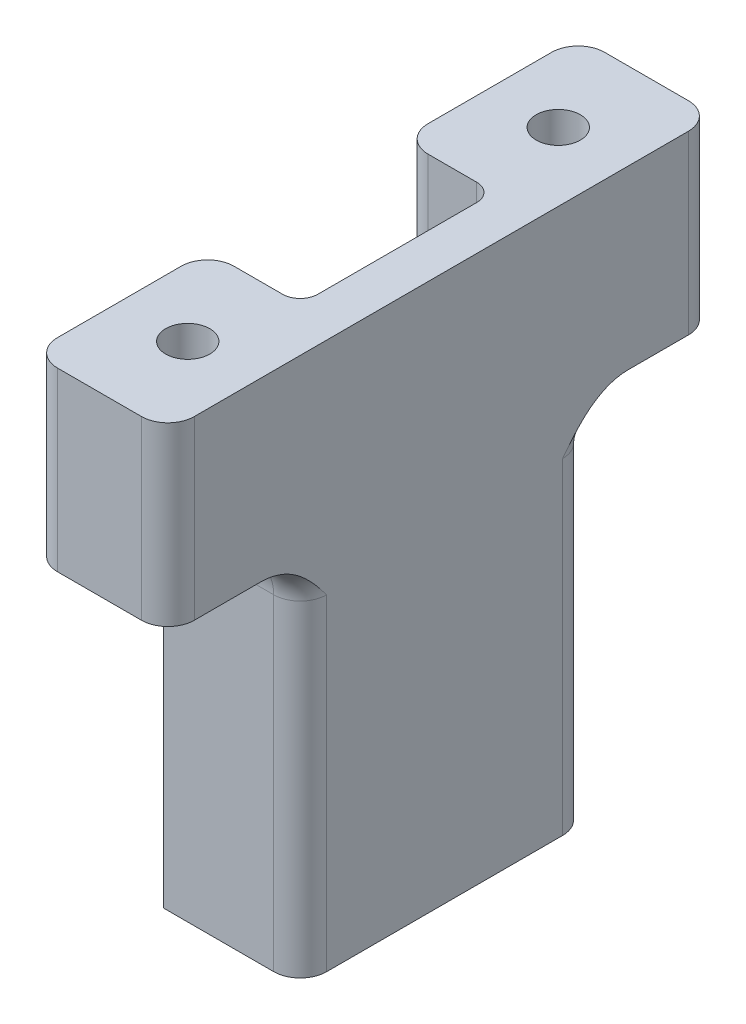
ISO-10303-21;
HEADER;
FILE_DESCRIPTION(('STEP AP214'),'2;1');
FILE_NAME('part.step','',(''),(''),'','','');
FILE_SCHEMA(('AUTOMOTIVE_DESIGN { 1 0 10303 214 1 1 1 1 }'));
ENDSEC;
DATA;
#1=APPLICATION_CONTEXT('core data for automotive mechanical design processes');
#2=APPLICATION_PROTOCOL_DEFINITION('international standard','automotive_design',2000,#1);
#3=PRODUCT_CONTEXT('',#1,'mechanical');
#4=PRODUCT('Part','Part','',(#3));
#5=PRODUCT_RELATED_PRODUCT_CATEGORY('part','',(#4));
#6=PRODUCT_DEFINITION_FORMATION('','',#4);
#7=PRODUCT_DEFINITION_CONTEXT('part definition',#1,'design');
#8=PRODUCT_DEFINITION('design','',#6,#7);
#9=PRODUCT_DEFINITION_SHAPE('','',#8);
#10=(LENGTH_UNIT() NAMED_UNIT(*) SI_UNIT(.MILLI.,.METRE.));
#11=(NAMED_UNIT(*) PLANE_ANGLE_UNIT() SI_UNIT($,.RADIAN.));
#12=(NAMED_UNIT(*) SI_UNIT($,.STERADIAN.) SOLID_ANGLE_UNIT());
#13=UNCERTAINTY_MEASURE_WITH_UNIT(LENGTH_MEASURE(1.E-05),#10,'distance_accuracy_value','');
#14=(GEOMETRIC_REPRESENTATION_CONTEXT(3) GLOBAL_UNCERTAINTY_ASSIGNED_CONTEXT((#13)) GLOBAL_UNIT_ASSIGNED_CONTEXT((#10,
#11,#12)) REPRESENTATION_CONTEXT('',''));
#15=CARTESIAN_POINT('',(0.,0.,0.));
#16=DIRECTION('',(0.,0.,1.));
#17=DIRECTION('',(1.,0.,0.));
#18=AXIS2_PLACEMENT_3D('',#15,#16,#17);
#19=CARTESIAN_POINT('',(7.36999999999956,-62.,31.370000000004));
#20=DIRECTION('',(1.,0.,0.));
#21=DIRECTION('',(0.,0.,-1.));
#22=AXIS2_PLACEMENT_3D('',#19,#20,#21);
#23=PLANE('',#22);
#24=DIRECTION('',(0.,0.,-1.));
#25=VECTOR('',#24,1.);
#26=CARTESIAN_POINT('',(7.36999999999956,-62.,31.370000000004));
#27=LINE('',#26,#25);
#28=CARTESIAN_POINT('',(7.36999999999938,-62.,13.370000000004));
#29=VERTEX_POINT('',#28);
#30=CARTESIAN_POINT('',(7.36999999999938,-62.,-13.370000000004));
#31=VERTEX_POINT('',#30);
#32=EDGE_CURVE('E348',#29,#31,#27,.T.);
#33=ORIENTED_EDGE('',*,*,#32,.T.);
#34=DIRECTION('',(0.,-1.,0.));
#35=VECTOR('',#34,1.);
#36=CARTESIAN_POINT('',(7.36999999999938,3.75394704043988,-13.370000000004));
#37=LINE('',#36,#35);
#38=CARTESIAN_POINT('',(7.36999999999938,-25.,-13.370000000004));
#39=VERTEX_POINT('',#38);
#40=EDGE_CURVE('E256',#39,#31,#37,.T.);
#41=ORIENTED_EDGE('',*,*,#40,.F.);
#42=CARTESIAN_POINT('',(7.36999999999947,-20.,-20.7861984870996));
#43=CARTESIAN_POINT('',(7.36999999999952,-19.999975273095,-20.61568528441));
#44=CARTESIAN_POINT('',(7.36999999999955,-20.0074935365838,-20.4452210422768));
#45=CARTESIAN_POINT('',(7.36999999999957,-20.036980049552,-20.105690824079));
#46=CARTESIAN_POINT('',(7.36999999999956,-20.0589355674421,-19.9366237488052));
#47=CARTESIAN_POINT('',(7.36999999999956,-20.1164639689542,-19.6020399618028));
#48=CARTESIAN_POINT('',(7.36999999999956,-20.1519420270762,-19.4365068175846));
#49=CARTESIAN_POINT('',(7.36999999999956,-20.2357731756868,-19.1087025047391));
#50=CARTESIAN_POINT('',(7.36999999999956,-20.2841301293666,-18.9464323306157));
#51=CARTESIAN_POINT('',(7.36999999999956,-20.4069214648221,-18.5846234537346));
#52=CARTESIAN_POINT('',(7.36999999999956,-20.4848649968072,-18.3862710713222));
#53=CARTESIAN_POINT('',(7.36999999999956,-20.6579850711179,-17.997249131493));
#54=CARTESIAN_POINT('',(7.36999999999956,-20.7531650661009,-17.8065811227145));
#55=CARTESIAN_POINT('',(7.36999999999956,-20.9589846922658,-17.4334220282964));
#56=CARTESIAN_POINT('',(7.36999999999956,-21.0696489080713,-17.250944567698));
#57=CARTESIAN_POINT('',(7.36999999999956,-21.30439320074,-16.8947740394538));
#58=CARTESIAN_POINT('',(7.36999999999956,-21.4284787062645,-16.7210845683928));
#59=CARTESIAN_POINT('',(7.36999999999956,-21.6768777004584,-16.3971148286885));
#60=CARTESIAN_POINT('',(7.36999999999956,-21.8002489741779,-16.246107443196));
#61=CARTESIAN_POINT('',(7.36999999999955,-22.0551167288309,-15.9510870646974));
#62=CARTESIAN_POINT('',(7.36999999999954,-22.1866151087736,-15.8070757205588));
#63=CARTESIAN_POINT('',(7.36999999999959,-22.5914536855793,-15.3845394799475));
#64=CARTESIAN_POINT('',(7.36999999999972,-22.8749495256254,-15.1157502649184));
#65=CARTESIAN_POINT('',(7.36999999999939,-23.4594492170119,-14.5969875936539));
#66=CARTESIAN_POINT('',(7.36999999999892,-23.760494826496,-14.3470625561483));
#67=CARTESIAN_POINT('',(7.37000000000019,-24.3706229288083,-13.8576217580581));
#68=CARTESIAN_POINT('',(7.37000000000193,-24.6797026839709,-13.6181025240875));
#69=CARTESIAN_POINT('',(7.36999999999953,-24.9925464416567,-13.3757735004658));
#70=CARTESIAN_POINT('',(7.3699999999995,-24.9962732216537,-13.3728867490946));
#71=CARTESIAN_POINT('',(7.36999999999947,-25.,-13.370000000004));
#72=B_SPLINE_CURVE_WITH_KNOTS('',3,(#42,#43,#44,#45,#46,#47,#48,#49,#50,#51,#52,#53,#54,#55,#56,
#57,#58,#59,#60,#61,#62,#63,#64,#65,#66,#67,#68,#69,#70,#71),.UNSPECIFIED.,.F.,.F.,(4,2,2,2,2,2,
2,2,2,2,2,2,2,2,4),(0.,0.511301398020987,1.02215250508978,1.52948533158812,2.0369705108664,
2.67538958451856,3.31393668242884,3.95350936869953,4.59334172451234,5.17800417114571,
5.76280375244944,6.93330785206522,8.10672075516194,9.27973892354683,9.29388105917068),.UNSPECIFIED.);
#73=CARTESIAN_POINT('',(7.36999999999947,-20.,-20.7861984870996));
#74=VERTEX_POINT('',#73);
#75=EDGE_CURVE('E414',#39,#74,#72,.F.);
#76=ORIENTED_EDGE('',*,*,#75,.T.);
#77=DIRECTION('',(0.,0.,-1.));
#78=VECTOR('',#77,1.);
#79=CARTESIAN_POINT('',(7.36999999999956,-20.,-28.370000000004));
#80=LINE('',#79,#78);
#81=CARTESIAN_POINT('',(7.36999999999955,-20.,-27.6299999999958));
#82=VERTEX_POINT('',#81);
#83=EDGE_CURVE('E243',#74,#82,#80,.T.);
#84=ORIENTED_EDGE('',*,*,#83,.T.);
#85=DIRECTION('',(0.,1.,0.));
#86=VECTOR('',#85,1.);
#87=CARTESIAN_POINT('',(7.36999999999956,-62.,-27.6299999999959));
#88=LINE('',#87,#86);
#89=CARTESIAN_POINT('',(7.36999999999956,0.,-27.6299999999959));
#90=VERTEX_POINT('',#89);
#91=EDGE_CURVE('E387',#82,#90,#88,.T.);
#92=ORIENTED_EDGE('',*,*,#91,.T.);
#93=DIRECTION('',(0.,0.,-1.));
#94=VECTOR('',#93,1.);
#95=CARTESIAN_POINT('',(7.36999999999956,0.,31.370000000004));
#96=LINE('',#95,#94);
#97=CARTESIAN_POINT('',(7.36999999999956,0.,28.370000000004));
#98=VERTEX_POINT('',#97);
#99=EDGE_CURVE('E333',#98,#90,#96,.T.);
#100=ORIENTED_EDGE('',*,*,#99,.F.);
#101=DIRECTION('',(0.,1.,0.));
#102=VECTOR('',#101,1.);
#103=CARTESIAN_POINT('',(7.36999999999956,-62.,28.370000000004));
#104=LINE('',#103,#102);
#105=CARTESIAN_POINT('',(7.36999999999956,-20.,28.370000000004));
#106=VERTEX_POINT('',#105);
#107=EDGE_CURVE('E384',#98,#106,#104,.F.);
#108=ORIENTED_EDGE('',*,*,#107,.T.);
#109=DIRECTION('',(0.,0.,1.));
#110=VECTOR('',#109,1.);
#111=CARTESIAN_POINT('',(7.36999999999956,-20.,28.370000000004));
#112=LINE('',#111,#110);
#113=CARTESIAN_POINT('',(7.36999999999947,-20.,20.7861984870996));
#114=VERTEX_POINT('',#113);
#115=EDGE_CURVE('E267',#114,#106,#112,.T.);
#116=ORIENTED_EDGE('',*,*,#115,.F.);
#117=CARTESIAN_POINT('',(7.36999999999947,-20.,20.7861984870996));
#118=CARTESIAN_POINT('',(7.36999999999952,-19.999975273095,20.61568528441));
#119=CARTESIAN_POINT('',(7.36999999999955,-20.0074935365838,20.4452210422768));
#120=CARTESIAN_POINT('',(7.36999999999957,-20.036980049552,20.105690824079));
#121=CARTESIAN_POINT('',(7.36999999999956,-20.0589355674421,19.9366237488052));
#122=CARTESIAN_POINT('',(7.36999999999956,-20.1164639689542,19.6020399618028));
#123=CARTESIAN_POINT('',(7.36999999999956,-20.1519420270762,19.4365068175846));
#124=CARTESIAN_POINT('',(7.36999999999956,-20.2357731756868,19.1087025047391));
#125=CARTESIAN_POINT('',(7.36999999999956,-20.2841301293666,18.9464323306157));
#126=CARTESIAN_POINT('',(7.36999999999956,-20.4069214648221,18.5846234537346));
#127=CARTESIAN_POINT('',(7.36999999999956,-20.4848649968072,18.3862710713222));
#128=CARTESIAN_POINT('',(7.36999999999956,-20.6579850711179,17.997249131493));
#129=CARTESIAN_POINT('',(7.36999999999956,-20.7531650661009,17.8065811227145));
#130=CARTESIAN_POINT('',(7.36999999999956,-20.9589846922658,17.4334220282964));
#131=CARTESIAN_POINT('',(7.36999999999956,-21.0696489080713,17.250944567698));
#132=CARTESIAN_POINT('',(7.36999999999956,-21.30439320074,16.8947740394538));
#133=CARTESIAN_POINT('',(7.36999999999956,-21.4284787062645,16.7210845683928));
#134=CARTESIAN_POINT('',(7.36999999999956,-21.6768777004584,16.3971148286885));
#135=CARTESIAN_POINT('',(7.36999999999956,-21.8002489741779,16.246107443196));
#136=CARTESIAN_POINT('',(7.36999999999955,-22.0551167288309,15.9510870646974));
#137=CARTESIAN_POINT('',(7.36999999999954,-22.1866151087736,15.8070757205588));
#138=CARTESIAN_POINT('',(7.36999999999959,-22.5914536855793,15.3845394799475));
#139=CARTESIAN_POINT('',(7.36999999999972,-22.8749495256254,15.1157502649184));
#140=CARTESIAN_POINT('',(7.36999999999939,-23.4594492170119,14.5969875936539));
#141=CARTESIAN_POINT('',(7.36999999999892,-23.760494826496,14.3470625561483));
#142=CARTESIAN_POINT('',(7.37000000000019,-24.3706229288083,13.8576217580581));
#143=CARTESIAN_POINT('',(7.37000000000193,-24.6797026839709,13.6181025240875));
#144=CARTESIAN_POINT('',(7.36999999999953,-24.9925464416567,13.3757735004658));
#145=CARTESIAN_POINT('',(7.3699999999995,-24.9962732216537,13.3728867490946));
#146=CARTESIAN_POINT('',(7.36999999999947,-25.,13.370000000004));
#147=B_SPLINE_CURVE_WITH_KNOTS('',3,(#117,#118,#119,#120,#121,#122,#123,#124,#125,#126,#127,
#128,#129,#130,#131,#132,#133,#134,#135,#136,#137,#138,#139,#140,#141,#142,#143,#144,#145,#146),
.UNSPECIFIED.,.F.,.F.,(4,2,2,2,2,2,2,2,2,2,2,2,2,2,4),(0.,0.511301398020987,1.02215250508978,
1.52948533158812,2.0369705108664,2.67538958451856,3.31393668242884,3.95350936869953,
4.59334172451234,5.17800417114571,5.76280375244944,6.93330785206522,8.10672075516194,
9.27973892354683,9.29388105917068),.UNSPECIFIED.);
#148=CARTESIAN_POINT('',(7.36999999999938,-25.,13.370000000004));
#149=VERTEX_POINT('',#148);
#150=EDGE_CURVE('E422',#114,#149,#147,.T.);
#151=ORIENTED_EDGE('',*,*,#150,.T.);
#152=DIRECTION('',(0.,-1.,0.));
#153=VECTOR('',#152,1.);
#154=CARTESIAN_POINT('',(7.36999999999938,3.75394704043988,13.370000000004));
#155=LINE('',#154,#153);
#156=EDGE_CURVE('E286',#149,#29,#155,.T.);
#157=ORIENTED_EDGE('',*,*,#156,.T.);
#158=EDGE_LOOP('',(#33,#41,#76,#84,#92,#100,#108,#116,#151,#157));
#159=FACE_BOUND('',#158,.T.);
#160=ADVANCED_FACE('F49',(#159),#23,.T.);
#161=CARTESIAN_POINT('',(-8.13000000000111,-62.,-30.6299999999959));
#162=DIRECTION('',(0.,0.,-1.));
#163=DIRECTION('',(-1.,0.,0.));
#164=AXIS2_PLACEMENT_3D('',#161,#162,#163);
#165=PLANE('',#164);
#166=DIRECTION('',(0.,1.,0.));
#167=VECTOR('',#166,1.);
#168=CARTESIAN_POINT('',(4.36999999999956,-62.,-30.6299999999959));
#169=LINE('',#168,#167);
#170=CARTESIAN_POINT('',(4.36999999999956,0.,-30.6299999999959));
#171=VERTEX_POINT('',#170);
#172=CARTESIAN_POINT('',(4.36999999999956,-20.,-30.6299999999959));
#173=VERTEX_POINT('',#172);
#174=EDGE_CURVE('E355',#171,#173,#169,.F.);
#175=ORIENTED_EDGE('',*,*,#174,.T.);
#176=DIRECTION('',(-1.,0.,0.));
#177=VECTOR('',#176,1.);
#178=CARTESIAN_POINT('',(-8.13000000000111,-20.,-30.6299999999959));
#179=LINE('',#178,#177);
#180=CARTESIAN_POINT('',(-5.13000000000111,-20.,-30.6299999999959));
#181=VERTEX_POINT('',#180);
#182=EDGE_CURVE('E248',#173,#181,#179,.T.);
#183=ORIENTED_EDGE('',*,*,#182,.T.);
#184=DIRECTION('',(0.,1.,0.));
#185=VECTOR('',#184,1.);
#186=CARTESIAN_POINT('',(-5.13000000000111,-62.,-30.6299999999959));
#187=LINE('',#186,#185);
#188=CARTESIAN_POINT('',(-5.13000000000111,0.,-30.6299999999959));
#189=VERTEX_POINT('',#188);
#190=EDGE_CURVE('E369',#181,#189,#187,.T.);
#191=ORIENTED_EDGE('',*,*,#190,.T.);
#192=DIRECTION('',(-1.,0.,0.));
#193=VECTOR('',#192,1.);
#194=CARTESIAN_POINT('',(-8.13000000000111,0.,-30.6299999999959));
#195=LINE('',#194,#193);
#196=EDGE_CURVE('E358',#171,#189,#195,.T.);
#197=ORIENTED_EDGE('',*,*,#196,.F.);
#198=EDGE_LOOP('',(#175,#183,#191,#197));
#199=FACE_BOUND('',#198,.T.);
#200=ADVANCED_FACE('F458',(#199),#165,.T.);
#201=CARTESIAN_POINT('',(-5.13000000000111,-62.,-27.6299999999959));
#202=DIRECTION('',(0.,1.,0.));
#203=DIRECTION('',(0.,0.,1.));
#204=AXIS2_PLACEMENT_3D('',#201,#202,#203);
#205=CYLINDRICAL_SURFACE('',#204,3.);
#206=ORIENTED_EDGE('',*,*,#190,.F.);
#207=CARTESIAN_POINT('',(-5.13000000000111,-20.,-27.6299999999959));
#208=DIRECTION('',(0.,-1.,0.));
#209=DIRECTION('',(0.,0.,-1.));
#210=AXIS2_PLACEMENT_3D('',#207,#208,#209);
#211=CIRCLE('',#210,3.);
#212=CARTESIAN_POINT('',(-8.13000000000108,-20.,-27.6299999999958));
#213=VERTEX_POINT('',#212);
#214=EDGE_CURVE('E263',#181,#213,#211,.F.);
#215=ORIENTED_EDGE('',*,*,#214,.T.);
#216=DIRECTION('',(0.,1.,0.));
#217=VECTOR('',#216,1.);
#218=CARTESIAN_POINT('',(-8.13000000000111,-62.,-27.6299999999959));
#219=LINE('',#218,#217);
#220=CARTESIAN_POINT('',(-8.13000000000111,0.,-27.6299999999959));
#221=VERTEX_POINT('',#220);
#222=EDGE_CURVE('E381',#221,#213,#219,.F.);
#223=ORIENTED_EDGE('',*,*,#222,.F.);
#224=CARTESIAN_POINT('',(-5.13000000000111,0.,-27.6299999999959));
#225=DIRECTION('',(0.,-1.,0.));
#226=DIRECTION('',(0.,0.,-1.));
#227=AXIS2_PLACEMENT_3D('',#224,#225,#226);
#228=CIRCLE('',#227,3.);
#229=EDGE_CURVE('E377',#189,#221,#228,.F.);
#230=ORIENTED_EDGE('',*,*,#229,.F.);
#231=EDGE_LOOP('',(#206,#215,#223,#230));
#232=FACE_BOUND('',#231,.T.);
#233=ADVANCED_FACE('F465',(#232),#205,.T.);
#234=CARTESIAN_POINT('',(4.36999999999956,-62.,-27.6299999999959));
#235=DIRECTION('',(0.,1.,0.));
#236=DIRECTION('',(0.,0.,1.));
#237=AXIS2_PLACEMENT_3D('',#234,#235,#236);
#238=CYLINDRICAL_SURFACE('',#237,3.);
#239=ORIENTED_EDGE('',*,*,#91,.F.);
#240=CARTESIAN_POINT('',(4.36999999999956,-20.,-27.6299999999959));
#241=DIRECTION('',(0.,-1.,0.));
#242=DIRECTION('',(0.,0.,-1.));
#243=AXIS2_PLACEMENT_3D('',#240,#241,#242);
#244=CIRCLE('',#243,3.);
#245=EDGE_CURVE('E394',#82,#173,#244,.F.);
#246=ORIENTED_EDGE('',*,*,#245,.T.);
#247=ORIENTED_EDGE('',*,*,#174,.F.);
#248=CARTESIAN_POINT('',(4.36999999999956,0.,-27.6299999999959));
#249=DIRECTION('',(0.,-1.,0.));
#250=DIRECTION('',(0.,0.,-1.));
#251=AXIS2_PLACEMENT_3D('',#248,#249,#250);
#252=CIRCLE('',#251,3.);
#253=EDGE_CURVE('E375',#90,#171,#252,.F.);
#254=ORIENTED_EDGE('',*,*,#253,.F.);
#255=EDGE_LOOP('',(#239,#246,#247,#254));
#256=FACE_BOUND('',#255,.T.);
#257=ADVANCED_FACE('F491',(#256),#238,.T.);
#258=CARTESIAN_POINT('',(-8.13000000000111,-62.,31.370000000004));
#259=DIRECTION('',(-1.,0.,0.));
#260=DIRECTION('',(0.,0.,1.));
#261=AXIS2_PLACEMENT_3D('',#258,#259,#260);
#262=PLANE('',#261);
#263=DIRECTION('',(0.,0.,1.));
#264=VECTOR('',#263,1.);
#265=CARTESIAN_POINT('',(-8.13000000000111,-62.,31.370000000004));
#266=LINE('',#265,#264);
#267=CARTESIAN_POINT('',(-8.13000000000064,-62.,14.3700000000041));
#268=VERTEX_POINT('',#267);
#269=CARTESIAN_POINT('',(-8.13000000000064,-62.,16.3700000000041));
#270=VERTEX_POINT('',#269);
#271=EDGE_CURVE('E351',#268,#270,#266,.T.);
#272=ORIENTED_EDGE('',*,*,#271,.T.);
#273=DIRECTION('',(0.,-1.,0.));
#274=VECTOR('',#273,1.);
#275=CARTESIAN_POINT('',(-8.13000000000064,3.75394704043988,16.3700000000041));
#276=LINE('',#275,#274);
#277=CARTESIAN_POINT('',(-8.13000000000064,-25.,16.3700000000041));
#278=VERTEX_POINT('',#277);
#279=EDGE_CURVE('E282',#278,#270,#276,.T.);
#280=ORIENTED_EDGE('',*,*,#279,.F.);
#281=CARTESIAN_POINT('',(-8.13000000000111,-25.,21.3700000000041));
#282=DIRECTION('',(-1.,0.,0.));
#283=DIRECTION('',(0.,0.,1.));
#284=AXIS2_PLACEMENT_3D('',#281,#282,#283);
#285=CIRCLE('',#284,5.);
#286=CARTESIAN_POINT('',(-8.13000000000083,-20.,21.3700000000041));
#287=VERTEX_POINT('',#286);
#288=EDGE_CURVE('E11',#278,#287,#285,.F.);
#289=ORIENTED_EDGE('',*,*,#288,.T.);
#290=DIRECTION('',(0.,0.,-1.));
#291=VECTOR('',#290,1.);
#292=CARTESIAN_POINT('',(-8.13000000000064,-20.,16.3700000000041));
#293=LINE('',#292,#291);
#294=CARTESIAN_POINT('',(-8.13000000000111,-20.,28.370000000004));
#295=VERTEX_POINT('',#294);
#296=EDGE_CURVE('E270',#295,#287,#293,.T.);
#297=ORIENTED_EDGE('',*,*,#296,.F.);
#298=DIRECTION('',(0.,1.,0.));
#299=VECTOR('',#298,1.);
#300=CARTESIAN_POINT('',(-8.13000000000111,-62.,28.370000000004));
#301=LINE('',#300,#299);
#302=CARTESIAN_POINT('',(-8.13000000000111,0.,28.370000000004));
#303=VERTEX_POINT('',#302);
#304=EDGE_CURVE('E379',#295,#303,#301,.T.);
#305=ORIENTED_EDGE('',*,*,#304,.T.);
#306=DIRECTION('',(0.,0.,1.));
#307=VECTOR('',#306,1.);
#308=CARTESIAN_POINT('',(-8.13000000000111,0.,31.370000000004));
#309=LINE('',#308,#307);
#310=CARTESIAN_POINT('',(-8.13000000000111,0.,14.3700000000041));
#311=VERTEX_POINT('',#310);
#312=EDGE_CURVE('E361',#311,#303,#309,.T.);
#313=ORIENTED_EDGE('',*,*,#312,.F.);
#314=DIRECTION('',(0.,1.,0.));
#315=VECTOR('',#314,1.);
#316=CARTESIAN_POINT('',(-8.13000000000064,-62.001,14.3700000000041));
#317=LINE('',#316,#315);
#318=EDGE_CURVE('E344',#268,#311,#317,.T.);
#319=ORIENTED_EDGE('',*,*,#318,.F.);
#320=EDGE_LOOP('',(#272,#280,#289,#297,#305,#313,#319));
#321=FACE_BOUND('',#320,.T.);
#322=ADVANCED_FACE('F516',(#321),#262,.T.);
#323=CARTESIAN_POINT('',(-8.13000000000111,-62.,31.370000000004));
#324=DIRECTION('',(0.,0.,1.));
#325=DIRECTION('',(1.,0.,0.));
#326=AXIS2_PLACEMENT_3D('',#323,#324,#325);
#327=PLANE('',#326);
#328=DIRECTION('',(0.,1.,0.));
#329=VECTOR('',#328,1.);
#330=CARTESIAN_POINT('',(-5.13000000000111,-62.,31.370000000004));
#331=LINE('',#330,#329);
#332=CARTESIAN_POINT('',(-5.13000000000111,0.,31.370000000004));
#333=VERTEX_POINT('',#332);
#334=CARTESIAN_POINT('',(-5.13000000000111,-20.,31.370000000004));
#335=VERTEX_POINT('',#334);
#336=EDGE_CURVE('E391',#333,#335,#331,.F.);
#337=ORIENTED_EDGE('',*,*,#336,.T.);
#338=DIRECTION('',(-1.,0.,0.));
#339=VECTOR('',#338,1.);
#340=CARTESIAN_POINT('',(-5.13000000000111,-20.,31.370000000004));
#341=LINE('',#340,#339);
#342=CARTESIAN_POINT('',(4.36999999999956,-20.,31.370000000004));
#343=VERTEX_POINT('',#342);
#344=EDGE_CURVE('E272',#343,#335,#341,.T.);
#345=ORIENTED_EDGE('',*,*,#344,.F.);
#346=DIRECTION('',(0.,1.,0.));
#347=VECTOR('',#346,1.);
#348=CARTESIAN_POINT('',(4.36999999999956,-62.,31.370000000004));
#349=LINE('',#348,#347);
#350=CARTESIAN_POINT('',(4.36999999999956,0.,31.370000000004));
#351=VERTEX_POINT('',#350);
#352=EDGE_CURVE('E389',#343,#351,#349,.T.);
#353=ORIENTED_EDGE('',*,*,#352,.T.);
#354=DIRECTION('',(1.,0.,0.));
#355=VECTOR('',#354,1.);
#356=CARTESIAN_POINT('',(-8.13000000000111,0.,31.370000000004));
#357=LINE('',#356,#355);
#358=EDGE_CURVE('E352',#333,#351,#357,.T.);
#359=ORIENTED_EDGE('',*,*,#358,.F.);
#360=EDGE_LOOP('',(#337,#345,#353,#359));
#361=FACE_BOUND('',#360,.T.);
#362=ADVANCED_FACE('F505',(#361),#327,.T.);
#363=CARTESIAN_POINT('',(-5.13000000000111,-62.,28.370000000004));
#364=DIRECTION('',(0.,1.,0.));
#365=DIRECTION('',(0.,0.,1.));
#366=AXIS2_PLACEMENT_3D('',#363,#364,#365);
#367=CYLINDRICAL_SURFACE('',#366,3.);
#368=ORIENTED_EDGE('',*,*,#304,.F.);
#369=CARTESIAN_POINT('',(-5.13000000000111,-20.,28.370000000004));
#370=DIRECTION('',(0.,-1.,0.));
#371=DIRECTION('',(0.,0.,-1.));
#372=AXIS2_PLACEMENT_3D('',#369,#370,#371);
#373=CIRCLE('',#372,3.);
#374=EDGE_CURVE('E274',#335,#295,#373,.T.);
#375=ORIENTED_EDGE('',*,*,#374,.F.);
#376=ORIENTED_EDGE('',*,*,#336,.F.);
#377=CARTESIAN_POINT('',(-5.13000000000111,0.,28.370000000004));
#378=DIRECTION('',(0.,-1.,0.));
#379=DIRECTION('',(0.,0.,-1.));
#380=AXIS2_PLACEMENT_3D('',#377,#378,#379);
#381=CIRCLE('',#380,3.);
#382=EDGE_CURVE('E373',#303,#333,#381,.F.);
#383=ORIENTED_EDGE('',*,*,#382,.F.);
#384=EDGE_LOOP('',(#368,#375,#376,#383));
#385=FACE_BOUND('',#384,.T.);
#386=ADVANCED_FACE('F511',(#385),#367,.T.);
#387=CARTESIAN_POINT('',(4.36999999999956,-62.,28.370000000004));
#388=DIRECTION('',(0.,1.,0.));
#389=DIRECTION('',(0.,0.,1.));
#390=AXIS2_PLACEMENT_3D('',#387,#388,#389);
#391=CYLINDRICAL_SURFACE('',#390,3.);
#392=ORIENTED_EDGE('',*,*,#352,.F.);
#393=CARTESIAN_POINT('',(4.36999999999956,-20.,28.370000000004));
#394=DIRECTION('',(0.,-1.,0.));
#395=DIRECTION('',(0.,0.,-1.));
#396=AXIS2_PLACEMENT_3D('',#393,#394,#395);
#397=CIRCLE('',#396,3.);
#398=EDGE_CURVE('E269',#106,#343,#397,.T.);
#399=ORIENTED_EDGE('',*,*,#398,.F.);
#400=ORIENTED_EDGE('',*,*,#107,.F.);
#401=CARTESIAN_POINT('',(4.36999999999956,0.,28.370000000004));
#402=DIRECTION('',(0.,-1.,0.));
#403=DIRECTION('',(0.,0.,-1.));
#404=AXIS2_PLACEMENT_3D('',#401,#402,#403);
#405=CIRCLE('',#404,3.);
#406=EDGE_CURVE('E371',#351,#98,#405,.F.);
#407=ORIENTED_EDGE('',*,*,#406,.F.);
#408=EDGE_LOOP('',(#392,#399,#400,#407));
#409=FACE_BOUND('',#408,.T.);
#410=ADVANCED_FACE('F438',(#409),#391,.T.);
#411=DIRECTION('',(0.,0.,1.));
#412=VECTOR('',#411,1.);
#413=CARTESIAN_POINT('',(-8.13000000000064,-20.,-16.3700000000041));
#414=LINE('',#413,#412);
#415=CARTESIAN_POINT('',(-8.13000000000083,-20.,-21.3700000000041));
#416=VERTEX_POINT('',#415);
#417=EDGE_CURVE('E245',#213,#416,#414,.T.);
#418=ORIENTED_EDGE('',*,*,#417,.T.);
#419=CARTESIAN_POINT('',(-8.13000000000111,-25.,-21.3700000000041));
#420=DIRECTION('',(-1.,0.,0.));
#421=DIRECTION('',(0.,0.,1.));
#422=AXIS2_PLACEMENT_3D('',#419,#420,#421);
#423=CIRCLE('',#422,5.);
#424=CARTESIAN_POINT('',(-8.13000000000064,-25.,-16.3700000000041));
#425=VERTEX_POINT('',#424);
#426=EDGE_CURVE('E58',#416,#425,#423,.F.);
#427=ORIENTED_EDGE('',*,*,#426,.T.);
#428=DIRECTION('',(0.,-1.,0.));
#429=VECTOR('',#428,1.);
#430=CARTESIAN_POINT('',(-8.13000000000064,3.75394704043988,-16.3700000000041));
#431=LINE('',#430,#429);
#432=CARTESIAN_POINT('',(-8.13000000000064,-62.,-16.3700000000041));
#433=VERTEX_POINT('',#432);
#434=EDGE_CURVE('E246',#425,#433,#431,.T.);
#435=ORIENTED_EDGE('',*,*,#434,.T.);
#436=CARTESIAN_POINT('',(-8.13000000000111,-62.,-13.6299999999959));
#437=VERTEX_POINT('',#436);
#438=EDGE_CURVE('E353',#433,#437,#266,.T.);
#439=ORIENTED_EDGE('',*,*,#438,.T.);
#440=DIRECTION('',(0.,1.,0.));
#441=VECTOR('',#440,1.);
#442=CARTESIAN_POINT('',(-8.13000000000091,-62.001,-13.6299999999959));
#443=LINE('',#442,#441);
#444=CARTESIAN_POINT('',(-8.13000000000091,0.,-13.6299999999959));
#445=VERTEX_POINT('',#444);
#446=EDGE_CURVE('E330',#437,#445,#443,.T.);
#447=ORIENTED_EDGE('',*,*,#446,.T.);
#448=EDGE_CURVE('E362',#221,#445,#309,.T.);
#449=ORIENTED_EDGE('',*,*,#448,.F.);
#450=ORIENTED_EDGE('',*,*,#222,.T.);
#451=EDGE_LOOP('',(#418,#427,#435,#439,#447,#449,#450));
#452=FACE_BOUND('',#451,.T.);
#453=ADVANCED_FACE('F559',(#452),#262,.T.);
#454=CARTESIAN_POINT('',(0.,-62.,0.));
#455=DIRECTION('',(0.,-1.,0.));
#456=DIRECTION('',(0.,0.,-1.));
#457=AXIS2_PLACEMENT_3D('',#454,#455,#456);
#458=PLANE('',#457);
#459=DIRECTION('',(-1.,0.,0.));
#460=VECTOR('',#459,1.);
#461=CARTESIAN_POINT('',(4.3699999999994,-62.,-16.370000000004));
#462=LINE('',#461,#460);
#463=CARTESIAN_POINT('',(4.3699999999994,-62.,-16.370000000004));
#464=VERTEX_POINT('',#463);
#465=EDGE_CURVE('E249',#464,#433,#462,.T.);
#466=ORIENTED_EDGE('',*,*,#465,.F.);
#467=CARTESIAN_POINT('',(4.36999999999937,-62.,-13.370000000004));
#468=DIRECTION('',(0.,1.,0.));
#469=DIRECTION('',(0.,0.,-1.));
#470=AXIS2_PLACEMENT_3D('',#467,#468,#469);
#471=CIRCLE('',#470,3.00000000000001);
#472=EDGE_CURVE('E252',#31,#464,#471,.T.);
#473=ORIENTED_EDGE('',*,*,#472,.F.);
#474=ORIENTED_EDGE('',*,*,#32,.F.);
#475=CARTESIAN_POINT('',(4.36999999999937,-62.,13.370000000004));
#476=DIRECTION('',(0.,-1.,0.));
#477=DIRECTION('',(0.,0.,1.));
#478=AXIS2_PLACEMENT_3D('',#475,#476,#477);
#479=CIRCLE('',#478,3.00000000000001);
#480=CARTESIAN_POINT('',(4.3699999999994,-62.,16.370000000004));
#481=VERTEX_POINT('',#480);
#482=EDGE_CURVE('E266',#29,#481,#479,.T.);
#483=ORIENTED_EDGE('',*,*,#482,.T.);
#484=DIRECTION('',(-1.,0.,0.));
#485=VECTOR('',#484,1.);
#486=CARTESIAN_POINT('',(4.3699999999994,-62.,16.370000000004));
#487=LINE('',#486,#485);
#488=EDGE_CURVE('E279',#481,#270,#487,.T.);
#489=ORIENTED_EDGE('',*,*,#488,.T.);
#490=ORIENTED_EDGE('',*,*,#271,.F.);
#491=CARTESIAN_POINT('',(-5.13000000000063,-62.,14.3700000000041));
#492=DIRECTION('',(0.,-1.,0.));
#493=DIRECTION('',(0.,0.,-1.));
#494=AXIS2_PLACEMENT_3D('',#491,#492,#493);
#495=CIRCLE('',#494,3.);
#496=CARTESIAN_POINT('',(-5.13000000000063,-62.,11.3700000000041));
#497=VERTEX_POINT('',#496);
#498=EDGE_CURVE('E276',#268,#497,#495,.T.);
#499=ORIENTED_EDGE('',*,*,#498,.T.);
#500=DIRECTION('',(1.,0.,0.));
#501=VECTOR('',#500,1.);
#502=CARTESIAN_POINT('',(0.369999999999343,-62.,11.370000000004));
#503=LINE('',#502,#501);
#504=CARTESIAN_POINT('',(0.369999999999343,-62.,11.370000000004));
#505=VERTEX_POINT('',#504);
#506=EDGE_CURVE('E292',#497,#505,#503,.T.);
#507=ORIENTED_EDGE('',*,*,#506,.T.);
#508=CARTESIAN_POINT('',(0.369999999999343,-62.,9.37000000000404));
#509=DIRECTION('',(0.,-1.,0.));
#510=DIRECTION('',(0.,0.,-1.));
#511=AXIS2_PLACEMENT_3D('',#508,#509,#510);
#512=CIRCLE('',#511,2.);
#513=CARTESIAN_POINT('',(2.36999999999934,-62.,9.37000000000402));
#514=VERTEX_POINT('',#513);
#515=EDGE_CURVE('E295',#505,#514,#512,.F.);
#516=ORIENTED_EDGE('',*,*,#515,.T.);
#517=DIRECTION('',(0.,0.,-1.));
#518=VECTOR('',#517,1.);
#519=CARTESIAN_POINT('',(2.36999999999915,-62.,-8.62999999999598));
#520=LINE('',#519,#518);
#521=CARTESIAN_POINT('',(2.36999999999915,-62.,-8.62999999999598));
#522=VERTEX_POINT('',#521);
#523=EDGE_CURVE('E298',#514,#522,#520,.T.);
#524=ORIENTED_EDGE('',*,*,#523,.T.);
#525=CARTESIAN_POINT('',(0.369999999999149,-62.,-8.62999999999596));
#526=DIRECTION('',(0.,-1.,0.));
#527=DIRECTION('',(0.,0.,-1.));
#528=AXIS2_PLACEMENT_3D('',#525,#526,#527);
#529=CIRCLE('',#528,2.);
#530=CARTESIAN_POINT('',(0.369999999999149,-62.,-10.629999999996));
#531=VERTEX_POINT('',#530);
#532=EDGE_CURVE('E301',#522,#531,#529,.F.);
#533=ORIENTED_EDGE('',*,*,#532,.T.);
#534=DIRECTION('',(-1.,0.,0.));
#535=VECTOR('',#534,1.);
#536=CARTESIAN_POINT('',(-5.13000000000091,-62.,-10.6299999999959));
#537=LINE('',#536,#535);
#538=CARTESIAN_POINT('',(-5.13000000000091,-62.,-10.6299999999959));
#539=VERTEX_POINT('',#538);
#540=EDGE_CURVE('E304',#531,#539,#537,.T.);
#541=ORIENTED_EDGE('',*,*,#540,.T.);
#542=CARTESIAN_POINT('',(-5.13000000000091,-62.,-13.6299999999959));
#543=DIRECTION('',(0.,-1.,0.));
#544=DIRECTION('',(0.,0.,-1.));
#545=AXIS2_PLACEMENT_3D('',#542,#543,#544);
#546=CIRCLE('',#545,3.);
#547=EDGE_CURVE('E307',#539,#437,#546,.T.);
#548=ORIENTED_EDGE('',*,*,#547,.T.);
#549=ORIENTED_EDGE('',*,*,#438,.F.);
#550=EDGE_LOOP('',(#466,#473,#474,#483,#489,#490,#499,#507,#516,#524,#533,#541,#548,#549));
#551=FACE_BOUND('',#550,.T.);
#552=ADVANCED_FACE('F474',(#551),#458,.T.);
#553=CARTESIAN_POINT('',(0.,0.,0.));
#554=DIRECTION('',(0.,-1.,0.));
#555=DIRECTION('',(0.,0.,-1.));
#556=AXIS2_PLACEMENT_3D('',#553,#554,#555);
#557=PLANE('',#556);
#558=CARTESIAN_POINT('',(-0.380000000000774,0.,-20.6299999999959));
#559=DIRECTION('',(0.,1.,0.));
#560=DIRECTION('',(0.,0.,1.));
#561=AXIS2_PLACEMENT_3D('',#558,#559,#560);
#562=CIRCLE('',#561,2.49999999999999);
#563=CARTESIAN_POINT('',(-0.380000000000774,0.,-18.1299999999959));
#564=VERTEX_POINT('',#563);
#565=EDGE_CURVE('E233',#564,#564,#562,.T.);
#566=ORIENTED_EDGE('',*,*,#565,.F.);
#567=EDGE_LOOP('',(#566));
#568=FACE_BOUND('',#567,.T.);
#569=CARTESIAN_POINT('',(-0.380000000000767,0.,21.370000000004));
#570=DIRECTION('',(0.,1.,0.));
#571=DIRECTION('',(0.,0.,1.));
#572=AXIS2_PLACEMENT_3D('',#569,#570,#571);
#573=CIRCLE('',#572,2.49999999999999);
#574=CARTESIAN_POINT('',(-0.380000000000767,0.,23.870000000004));
#575=VERTEX_POINT('',#574);
#576=EDGE_CURVE('E232',#575,#575,#573,.T.);
#577=ORIENTED_EDGE('',*,*,#576,.F.);
#578=EDGE_LOOP('',(#577));
#579=FACE_BOUND('',#578,.T.);
#580=ORIENTED_EDGE('',*,*,#448,.T.);
#581=CARTESIAN_POINT('',(-5.13000000000091,0.,-13.6299999999959));
#582=DIRECTION('',(0.,-1.,0.));
#583=DIRECTION('',(0.,0.,1.));
#584=AXIS2_PLACEMENT_3D('',#581,#582,#583);
#585=CIRCLE('',#584,3.);
#586=CARTESIAN_POINT('',(-5.13000000000091,0.,-10.6299999999959));
#587=VERTEX_POINT('',#586);
#588=EDGE_CURVE('E310',#587,#445,#585,.T.);
#589=ORIENTED_EDGE('',*,*,#588,.F.);
#590=DIRECTION('',(-1.,0.,0.));
#591=VECTOR('',#590,1.);
#592=CARTESIAN_POINT('',(-5.13000000000091,0.,-10.6299999999959));
#593=LINE('',#592,#591);
#594=CARTESIAN_POINT('',(0.369999999999122,0.,-10.629999999996));
#595=VERTEX_POINT('',#594);
#596=EDGE_CURVE('E327',#595,#587,#593,.T.);
#597=ORIENTED_EDGE('',*,*,#596,.F.);
#598=CARTESIAN_POINT('',(0.369999999999149,0.,-8.62999999999596));
#599=DIRECTION('',(0.,1.,0.));
#600=DIRECTION('',(0.,0.,1.));
#601=AXIS2_PLACEMENT_3D('',#598,#599,#600);
#602=CIRCLE('',#601,2.);
#603=CARTESIAN_POINT('',(2.36999999999915,0.,-8.62999999999598));
#604=VERTEX_POINT('',#603);
#605=EDGE_CURVE('E324',#604,#595,#602,.T.);
#606=ORIENTED_EDGE('',*,*,#605,.F.);
#607=DIRECTION('',(0.,0.,-1.));
#608=VECTOR('',#607,1.);
#609=CARTESIAN_POINT('',(2.36999999999915,0.,-8.62999999999598));
#610=LINE('',#609,#608);
#611=CARTESIAN_POINT('',(2.36999999999934,0.,9.37000000000402));
#612=VERTEX_POINT('',#611);
#613=EDGE_CURVE('E321',#612,#604,#610,.T.);
#614=ORIENTED_EDGE('',*,*,#613,.F.);
#615=CARTESIAN_POINT('',(0.369999999999343,0.,9.37000000000404));
#616=DIRECTION('',(0.,1.,0.));
#617=DIRECTION('',(0.,0.,1.));
#618=AXIS2_PLACEMENT_3D('',#615,#616,#617);
#619=CIRCLE('',#618,2.);
#620=CARTESIAN_POINT('',(0.369999999999343,0.,11.370000000004));
#621=VERTEX_POINT('',#620);
#622=EDGE_CURVE('E318',#621,#612,#619,.T.);
#623=ORIENTED_EDGE('',*,*,#622,.F.);
#624=DIRECTION('',(1.,0.,0.));
#625=VECTOR('',#624,1.);
#626=CARTESIAN_POINT('',(0.369999999999343,0.,11.370000000004));
#627=LINE('',#626,#625);
#628=CARTESIAN_POINT('',(-5.13000000000066,0.,11.3700000000041));
#629=VERTEX_POINT('',#628);
#630=EDGE_CURVE('E315',#629,#621,#627,.T.);
#631=ORIENTED_EDGE('',*,*,#630,.F.);
#632=CARTESIAN_POINT('',(-5.13000000000063,0.,14.3700000000041));
#633=DIRECTION('',(0.,-1.,0.));
#634=DIRECTION('',(0.,0.,1.));
#635=AXIS2_PLACEMENT_3D('',#632,#633,#634);
#636=CIRCLE('',#635,3.);
#637=EDGE_CURVE('E312',#311,#629,#636,.T.);
#638=ORIENTED_EDGE('',*,*,#637,.F.);
#639=ORIENTED_EDGE('',*,*,#312,.T.);
#640=ORIENTED_EDGE('',*,*,#382,.T.);
#641=ORIENTED_EDGE('',*,*,#358,.T.);
#642=ORIENTED_EDGE('',*,*,#406,.T.);
#643=ORIENTED_EDGE('',*,*,#99,.T.);
#644=ORIENTED_EDGE('',*,*,#253,.T.);
#645=ORIENTED_EDGE('',*,*,#196,.T.);
#646=ORIENTED_EDGE('',*,*,#229,.T.);
#647=EDGE_LOOP('',(#580,#589,#597,#606,#614,#623,#631,#638,#639,#640,#641,#642,#643,#644,#645,#646));
#648=FACE_BOUND('',#647,.T.);
#649=ADVANCED_FACE('F534',(#568,#579,#648),#557,.F.);
#650=CARTESIAN_POINT('',(-5.13000000000091,-62.001,-13.6299999999959));
#651=DIRECTION('',(0.,1.,0.));
#652=DIRECTION('',(0.,0.,1.));
#653=AXIS2_PLACEMENT_3D('',#650,#651,#652);
#654=CYLINDRICAL_SURFACE('',#653,3.);
#655=DIRECTION('',(0.,1.,0.));
#656=VECTOR('',#655,1.);
#657=CARTESIAN_POINT('',(-5.13000000000091,-62.001,-10.6299999999959));
#658=LINE('',#657,#656);
#659=EDGE_CURVE('E331',#539,#587,#658,.T.);
#660=ORIENTED_EDGE('',*,*,#659,.T.);
#661=ORIENTED_EDGE('',*,*,#588,.T.);
#662=ORIENTED_EDGE('',*,*,#446,.F.);
#663=ORIENTED_EDGE('',*,*,#547,.F.);
#664=EDGE_LOOP('',(#660,#661,#662,#663));
#665=FACE_BOUND('',#664,.T.);
#666=ADVANCED_FACE('F556',(#665),#654,.T.);
#667=CARTESIAN_POINT('',(-5.13000000000091,-62.001,-10.6299999999959));
#668=DIRECTION('',(0.,0.,-1.));
#669=DIRECTION('',(-1.,0.,0.));
#670=AXIS2_PLACEMENT_3D('',#667,#668,#669);
#671=PLANE('',#670);
#672=DIRECTION('',(0.,1.,0.));
#673=VECTOR('',#672,1.);
#674=CARTESIAN_POINT('',(0.369999999999122,-62.001,-10.629999999996));
#675=LINE('',#674,#673);
#676=EDGE_CURVE('E334',#531,#595,#675,.T.);
#677=ORIENTED_EDGE('',*,*,#676,.T.);
#678=ORIENTED_EDGE('',*,*,#596,.T.);
#679=ORIENTED_EDGE('',*,*,#659,.F.);
#680=ORIENTED_EDGE('',*,*,#540,.F.);
#681=EDGE_LOOP('',(#677,#678,#679,#680));
#682=FACE_BOUND('',#681,.T.);
#683=ADVANCED_FACE('F553',(#682),#671,.F.);
#684=CARTESIAN_POINT('',(0.369999999999149,-62.001,-8.62999999999596));
#685=DIRECTION('',(0.,1.,0.));
#686=DIRECTION('',(0.,0.,1.));
#687=AXIS2_PLACEMENT_3D('',#684,#685,#686);
#688=CYLINDRICAL_SURFACE('',#687,2.);
#689=DIRECTION('',(0.,1.,0.));
#690=VECTOR('',#689,1.);
#691=CARTESIAN_POINT('',(2.36999999999915,-62.001,-8.62999999999598));
#692=LINE('',#691,#690);
#693=EDGE_CURVE('E336',#522,#604,#692,.T.);
#694=ORIENTED_EDGE('',*,*,#693,.T.);
#695=ORIENTED_EDGE('',*,*,#605,.T.);
#696=ORIENTED_EDGE('',*,*,#676,.F.);
#697=ORIENTED_EDGE('',*,*,#532,.F.);
#698=EDGE_LOOP('',(#694,#695,#696,#697));
#699=FACE_BOUND('',#698,.T.);
#700=ADVANCED_FACE('F548',(#699),#688,.F.);
#701=CARTESIAN_POINT('',(2.36999999999915,-62.001,-8.62999999999598));
#702=DIRECTION('',(1.,0.,0.));
#703=DIRECTION('',(0.,0.,-1.));
#704=AXIS2_PLACEMENT_3D('',#701,#702,#703);
#705=PLANE('',#704);
#706=DIRECTION('',(0.,1.,0.));
#707=VECTOR('',#706,1.);
#708=CARTESIAN_POINT('',(2.36999999999934,-62.001,9.37000000000402));
#709=LINE('',#708,#707);
#710=EDGE_CURVE('E338',#514,#612,#709,.T.);
#711=ORIENTED_EDGE('',*,*,#710,.T.);
#712=ORIENTED_EDGE('',*,*,#613,.T.);
#713=ORIENTED_EDGE('',*,*,#693,.F.);
#714=ORIENTED_EDGE('',*,*,#523,.F.);
#715=EDGE_LOOP('',(#711,#712,#713,#714));
#716=FACE_BOUND('',#715,.T.);
#717=ADVANCED_FACE('F544',(#716),#705,.F.);
#718=CARTESIAN_POINT('',(0.369999999999343,-62.001,9.37000000000404));
#719=DIRECTION('',(0.,1.,0.));
#720=DIRECTION('',(0.,0.,1.));
#721=AXIS2_PLACEMENT_3D('',#718,#719,#720);
#722=CYLINDRICAL_SURFACE('',#721,2.);
#723=DIRECTION('',(0.,1.,0.));
#724=VECTOR('',#723,1.);
#725=CARTESIAN_POINT('',(0.369999999999343,-62.001,11.370000000004));
#726=LINE('',#725,#724);
#727=EDGE_CURVE('E340',#505,#621,#726,.T.);
#728=ORIENTED_EDGE('',*,*,#727,.T.);
#729=ORIENTED_EDGE('',*,*,#622,.T.);
#730=ORIENTED_EDGE('',*,*,#710,.F.);
#731=ORIENTED_EDGE('',*,*,#515,.F.);
#732=EDGE_LOOP('',(#728,#729,#730,#731));
#733=FACE_BOUND('',#732,.T.);
#734=ADVANCED_FACE('F542',(#733),#722,.F.);
#735=CARTESIAN_POINT('',(0.369999999999343,-62.001,11.370000000004));
#736=DIRECTION('',(0.,0.,1.));
#737=DIRECTION('',(1.,0.,0.));
#738=AXIS2_PLACEMENT_3D('',#735,#736,#737);
#739=PLANE('',#738);
#740=DIRECTION('',(0.,1.,0.));
#741=VECTOR('',#740,1.);
#742=CARTESIAN_POINT('',(-5.13000000000066,-62.001,11.3700000000041));
#743=LINE('',#742,#741);
#744=EDGE_CURVE('E342',#497,#629,#743,.T.);
#745=ORIENTED_EDGE('',*,*,#744,.T.);
#746=ORIENTED_EDGE('',*,*,#630,.T.);
#747=ORIENTED_EDGE('',*,*,#727,.F.);
#748=ORIENTED_EDGE('',*,*,#506,.F.);
#749=EDGE_LOOP('',(#745,#746,#747,#748));
#750=FACE_BOUND('',#749,.T.);
#751=ADVANCED_FACE('F539',(#750),#739,.F.);
#752=CARTESIAN_POINT('',(-5.13000000000063,-62.001,14.3700000000041));
#753=DIRECTION('',(0.,1.,0.));
#754=DIRECTION('',(0.,0.,1.));
#755=AXIS2_PLACEMENT_3D('',#752,#753,#754);
#756=CYLINDRICAL_SURFACE('',#755,3.);
#757=ORIENTED_EDGE('',*,*,#318,.T.);
#758=ORIENTED_EDGE('',*,*,#637,.T.);
#759=ORIENTED_EDGE('',*,*,#744,.F.);
#760=ORIENTED_EDGE('',*,*,#498,.F.);
#761=EDGE_LOOP('',(#757,#758,#759,#760));
#762=FACE_BOUND('',#761,.T.);
#763=ADVANCED_FACE('F531',(#762),#756,.T.);
#764=CARTESIAN_POINT('',(4.3699999999994,3.75394704043988,16.370000000004));
#765=DIRECTION('',(0.,0.,1.));
#766=DIRECTION('',(1.,0.,0.));
#767=AXIS2_PLACEMENT_3D('',#764,#765,#766);
#768=PLANE('',#767);
#769=DIRECTION('',(0.,-1.,0.));
#770=VECTOR('',#769,1.);
#771=CARTESIAN_POINT('',(4.3699999999994,3.75394704043988,16.370000000004));
#772=LINE('',#771,#770);
#773=CARTESIAN_POINT('',(4.3699999999994,-25.,16.370000000004));
#774=VERTEX_POINT('',#773);
#775=EDGE_CURVE('E284',#774,#481,#772,.T.);
#776=ORIENTED_EDGE('',*,*,#775,.F.);
#777=DIRECTION('',(1.,0.,0.));
#778=VECTOR('',#777,1.);
#779=CARTESIAN_POINT('',(-8.13000000000064,-25.,16.3700000000041));
#780=LINE('',#779,#778);
#781=EDGE_CURVE('E66',#774,#278,#780,.F.);
#782=ORIENTED_EDGE('',*,*,#781,.T.);
#783=ORIENTED_EDGE('',*,*,#279,.T.);
#784=ORIENTED_EDGE('',*,*,#488,.F.);
#785=EDGE_LOOP('',(#776,#782,#783,#784));
#786=FACE_BOUND('',#785,.T.);
#787=ADVANCED_FACE('F526',(#786),#768,.T.);
#788=CARTESIAN_POINT('',(4.36999999999937,3.75394704043988,13.370000000004));
#789=DIRECTION('',(0.,-1.,0.));
#790=DIRECTION('',(0.,0.,-1.));
#791=AXIS2_PLACEMENT_3D('',#788,#789,#790);
#792=CYLINDRICAL_SURFACE('',#791,3.00000000000001);
#793=ORIENTED_EDGE('',*,*,#156,.F.);
#794=CARTESIAN_POINT('',(4.36999999999937,-25.,13.370000000004));
#795=DIRECTION('',(0.,-1.,0.));
#796=DIRECTION('',(0.,0.,-1.));
#797=AXIS2_PLACEMENT_3D('',#794,#795,#796);
#798=CIRCLE('',#797,3.00000000000001);
#799=EDGE_CURVE('E409',#149,#774,#798,.T.);
#800=ORIENTED_EDGE('',*,*,#799,.T.);
#801=ORIENTED_EDGE('',*,*,#775,.T.);
#802=ORIENTED_EDGE('',*,*,#482,.F.);
#803=EDGE_LOOP('',(#793,#800,#801,#802));
#804=FACE_BOUND('',#803,.T.);
#805=ADVANCED_FACE('F524',(#804),#792,.T.);
#806=CARTESIAN_POINT('',(-27.1300000000003,-20.,2.730000000004));
#807=DIRECTION('',(0.,-1.,0.));
#808=DIRECTION('',(0.,0.,-1.));
#809=AXIS2_PLACEMENT_3D('',#806,#807,#808);
#810=PLANE('',#809);
#811=DIRECTION('',(1.,0.,0.));
#812=VECTOR('',#811,1.);
#813=CARTESIAN_POINT('',(4.36999999999945,-20.,21.370000000004));
#814=LINE('',#813,#812);
#815=CARTESIAN_POINT('',(4.36999999999945,-20.,21.370000000004));
#816=VERTEX_POINT('',#815);
#817=EDGE_CURVE('E404',#287,#816,#814,.T.);
#818=ORIENTED_EDGE('',*,*,#817,.T.);
#819=CARTESIAN_POINT('',(4.36999999999937,-20.,13.370000000004));
#820=DIRECTION('',(0.,-1.,0.));
#821=DIRECTION('',(0.,0.,-1.));
#822=AXIS2_PLACEMENT_3D('',#819,#820,#821);
#823=CIRCLE('',#822,8.00000000000001);
#824=EDGE_CURVE('E406',#816,#114,#823,.F.);
#825=ORIENTED_EDGE('',*,*,#824,.T.);
#826=ORIENTED_EDGE('',*,*,#115,.T.);
#827=ORIENTED_EDGE('',*,*,#398,.T.);
#828=ORIENTED_EDGE('',*,*,#344,.T.);
#829=ORIENTED_EDGE('',*,*,#374,.T.);
#830=ORIENTED_EDGE('',*,*,#296,.T.);
#831=EDGE_LOOP('',(#818,#825,#826,#827,#828,#829,#830));
#832=FACE_BOUND('',#831,.T.);
#833=ADVANCED_FACE('F502',(#832),#810,.T.);
#834=CARTESIAN_POINT('',(4.3699999999994,3.75394704043988,-16.370000000004));
#835=DIRECTION('',(0.,0.,1.));
#836=DIRECTION('',(1.,0.,0.));
#837=AXIS2_PLACEMENT_3D('',#834,#835,#836);
#838=PLANE('',#837);
#839=ORIENTED_EDGE('',*,*,#434,.F.);
#840=DIRECTION('',(1.,0.,0.));
#841=VECTOR('',#840,1.);
#842=CARTESIAN_POINT('',(4.3699999999994,-25.,-16.370000000004));
#843=LINE('',#842,#841);
#844=CARTESIAN_POINT('',(4.3699999999994,-25.,-16.370000000004));
#845=VERTEX_POINT('',#844);
#846=EDGE_CURVE('E411',#425,#845,#843,.T.);
#847=ORIENTED_EDGE('',*,*,#846,.T.);
#848=DIRECTION('',(0.,-1.,0.));
#849=VECTOR('',#848,1.);
#850=CARTESIAN_POINT('',(4.3699999999994,3.75394704043988,-16.370000000004));
#851=LINE('',#850,#849);
#852=EDGE_CURVE('E258',#845,#464,#851,.T.);
#853=ORIENTED_EDGE('',*,*,#852,.T.);
#854=ORIENTED_EDGE('',*,*,#465,.T.);
#855=EDGE_LOOP('',(#839,#847,#853,#854));
#856=FACE_BOUND('',#855,.T.);
#857=ADVANCED_FACE('F567',(#856),#838,.F.);
#858=CARTESIAN_POINT('',(4.36999999999937,3.75394704043988,-13.370000000004));
#859=DIRECTION('',(0.,-1.,0.));
#860=DIRECTION('',(0.,0.,-1.));
#861=AXIS2_PLACEMENT_3D('',#858,#859,#860);
#862=CYLINDRICAL_SURFACE('',#861,3.00000000000001);
#863=ORIENTED_EDGE('',*,*,#852,.F.);
#864=CARTESIAN_POINT('',(4.36999999999937,-25.,-13.370000000004));
#865=DIRECTION('',(0.,-1.,0.));
#866=DIRECTION('',(0.,0.,-1.));
#867=AXIS2_PLACEMENT_3D('',#864,#865,#866);
#868=CIRCLE('',#867,3.00000000000001);
#869=EDGE_CURVE('E397',#845,#39,#868,.T.);
#870=ORIENTED_EDGE('',*,*,#869,.T.);
#871=ORIENTED_EDGE('',*,*,#40,.T.);
#872=ORIENTED_EDGE('',*,*,#472,.T.);
#873=EDGE_LOOP('',(#863,#870,#871,#872));
#874=FACE_BOUND('',#873,.T.);
#875=ADVANCED_FACE('F478',(#874),#862,.T.);
#876=CARTESIAN_POINT('',(-27.1300000000003,-20.,2.730000000004));
#877=DIRECTION('',(0.,-1.,0.));
#878=DIRECTION('',(0.,0.,-1.));
#879=AXIS2_PLACEMENT_3D('',#876,#877,#878);
#880=PLANE('',#879);
#881=ORIENTED_EDGE('',*,*,#83,.F.);
#882=CARTESIAN_POINT('',(4.36999999999937,-20.,-13.370000000004));
#883=DIRECTION('',(0.,-1.,0.));
#884=DIRECTION('',(0.,0.,-1.));
#885=AXIS2_PLACEMENT_3D('',#882,#883,#884);
#886=CIRCLE('',#885,8.00000000000001);
#887=CARTESIAN_POINT('',(4.36999999999945,-20.,-21.370000000004));
#888=VERTEX_POINT('',#887);
#889=EDGE_CURVE('E402',#74,#888,#886,.F.);
#890=ORIENTED_EDGE('',*,*,#889,.T.);
#891=DIRECTION('',(1.,0.,0.));
#892=VECTOR('',#891,1.);
#893=CARTESIAN_POINT('',(-27.1300000000001,-20.,-21.3700000000043));
#894=LINE('',#893,#892);
#895=EDGE_CURVE('E400',#888,#416,#894,.F.);
#896=ORIENTED_EDGE('',*,*,#895,.T.);
#897=ORIENTED_EDGE('',*,*,#417,.F.);
#898=ORIENTED_EDGE('',*,*,#214,.F.);
#899=ORIENTED_EDGE('',*,*,#182,.F.);
#900=ORIENTED_EDGE('',*,*,#245,.F.);
#901=EDGE_LOOP('',(#881,#890,#896,#897,#898,#899,#900));
#902=FACE_BOUND('',#901,.T.);
#903=ADVANCED_FACE('F441',(#902),#880,.T.);
#904=CARTESIAN_POINT('',(4.36999999999945,-25.,-21.370000000004));
#905=DIRECTION('',(1.,0.,0.));
#906=DIRECTION('',(0.,0.,-1.));
#907=AXIS2_PLACEMENT_3D('',#904,#905,#906);
#908=CYLINDRICAL_SURFACE('',#907,5.);
#909=ORIENTED_EDGE('',*,*,#426,.F.);
#910=ORIENTED_EDGE('',*,*,#895,.F.);
#911=CARTESIAN_POINT('',(4.36999999999945,-25.,-21.370000000004));
#912=DIRECTION('',(-1.,0.,0.));
#913=DIRECTION('',(0.,0.,1.));
#914=AXIS2_PLACEMENT_3D('',#911,#912,#913);
#915=CIRCLE('',#914,5.);
#916=EDGE_CURVE('E253',#845,#888,#915,.T.);
#917=ORIENTED_EDGE('',*,*,#916,.F.);
#918=ORIENTED_EDGE('',*,*,#846,.F.);
#919=EDGE_LOOP('',(#909,#910,#917,#918));
#920=FACE_BOUND('',#919,.T.);
#921=ADVANCED_FACE('F436',(#920),#908,.F.);
#922=CARTESIAN_POINT('',(4.36999999999937,-25.,-13.370000000004));
#923=DIRECTION('',(0.,-1.,0.));
#924=DIRECTION('',(0.,0.,-1.));
#925=AXIS2_PLACEMENT_3D('',#922,#923,#924);
#926=TOROIDAL_SURFACE('',#925,8.00000000000001,5.);
#927=ORIENTED_EDGE('',*,*,#916,.T.);
#928=ORIENTED_EDGE('',*,*,#889,.F.);
#929=ORIENTED_EDGE('',*,*,#75,.F.);
#930=ORIENTED_EDGE('',*,*,#869,.F.);
#931=EDGE_LOOP('',(#927,#928,#929,#930));
#932=FACE_BOUND('',#931,.T.);
#933=ADVANCED_FACE('F431',(#932),#926,.F.);
#934=CARTESIAN_POINT('',(-27.1300000000002,-25.,21.3700000000043));
#935=DIRECTION('',(-1.,0.,0.));
#936=DIRECTION('',(0.,0.,1.));
#937=AXIS2_PLACEMENT_3D('',#934,#935,#936);
#938=CYLINDRICAL_SURFACE('',#937,5.);
#939=ORIENTED_EDGE('',*,*,#288,.F.);
#940=ORIENTED_EDGE('',*,*,#781,.F.);
#941=CARTESIAN_POINT('',(4.36999999999945,-25.,21.370000000004));
#942=DIRECTION('',(-1.,0.,0.));
#943=DIRECTION('',(0.,0.,1.));
#944=AXIS2_PLACEMENT_3D('',#941,#942,#943);
#945=CIRCLE('',#944,5.);
#946=EDGE_CURVE('E53',#816,#774,#945,.T.);
#947=ORIENTED_EDGE('',*,*,#946,.F.);
#948=ORIENTED_EDGE('',*,*,#817,.F.);
#949=EDGE_LOOP('',(#939,#940,#947,#948));
#950=FACE_BOUND('',#949,.T.);
#951=ADVANCED_FACE('F51',(#950),#938,.F.);
#952=CARTESIAN_POINT('',(4.36999999999937,-25.,13.370000000004));
#953=DIRECTION('',(0.,-1.,0.));
#954=DIRECTION('',(0.,0.,-1.));
#955=AXIS2_PLACEMENT_3D('',#952,#953,#954);
#956=TOROIDAL_SURFACE('',#955,8.00000000000001,5.);
#957=ORIENTED_EDGE('',*,*,#946,.T.);
#958=ORIENTED_EDGE('',*,*,#799,.F.);
#959=ORIENTED_EDGE('',*,*,#150,.F.);
#960=ORIENTED_EDGE('',*,*,#824,.F.);
#961=EDGE_LOOP('',(#957,#958,#959,#960));
#962=FACE_BOUND('',#961,.T.);
#963=ADVANCED_FACE('F443',(#962),#956,.F.);
#964=CARTESIAN_POINT('',(-0.380000000000767,-15.,21.370000000004));
#965=DIRECTION('',(0.,1.,0.));
#966=DIRECTION('',(0.,0.,1.));
#967=AXIS2_PLACEMENT_3D('',#964,#965,#966);
#968=CONICAL_SURFACE('',#967,2.49999999999999,1.02974425867665);
#969=CARTESIAN_POINT('',(-0.380000000000771,-16.5021515475689,21.370000000004));
#970=VERTEX_POINT('',#969);
#971=VERTEX_LOOP('',#970);
#972=FACE_BOUND('',#971,.T.);
#973=CARTESIAN_POINT('',(-0.380000000000767,-15.,21.370000000004));
#974=DIRECTION('',(0.,1.,0.));
#975=DIRECTION('',(0.,0.,1.));
#976=AXIS2_PLACEMENT_3D('',#973,#974,#975);
#977=CIRCLE('',#976,2.49999999999999);
#978=CARTESIAN_POINT('',(-0.380000000000767,-15.,23.870000000004));
#979=VERTEX_POINT('',#978);
#980=EDGE_CURVE('E236',#979,#979,#977,.T.);
#981=ORIENTED_EDGE('',*,*,#980,.T.);
#982=EDGE_LOOP('',(#981));
#983=FACE_BOUND('',#982,.T.);
#984=ADVANCED_FACE('F446',(#972,#983),#968,.F.);
#985=CARTESIAN_POINT('',(-0.380000000000767,0.,21.370000000004));
#986=DIRECTION('',(0.,1.,0.));
#987=DIRECTION('',(0.,0.,1.));
#988=AXIS2_PLACEMENT_3D('',#985,#986,#987);
#989=CYLINDRICAL_SURFACE('',#988,2.49999999999999);
#990=ORIENTED_EDGE('',*,*,#980,.F.);
#991=EDGE_LOOP('',(#990));
#992=FACE_BOUND('',#991,.T.);
#993=ORIENTED_EDGE('',*,*,#576,.T.);
#994=EDGE_LOOP('',(#993));
#995=FACE_BOUND('',#994,.T.);
#996=ADVANCED_FACE('F226',(#992,#995),#989,.F.);
#997=CARTESIAN_POINT('',(-0.380000000000774,-15.,-20.6299999999959));
#998=DIRECTION('',(0.,1.,0.));
#999=DIRECTION('',(0.,0.,1.));
#1000=AXIS2_PLACEMENT_3D('',#997,#998,#999);
#1001=CONICAL_SURFACE('',#1000,2.49999999999999,1.02974425867665);
#1002=CARTESIAN_POINT('',(-0.380000000000778,-16.5021515475689,-20.6299999999959));
#1003=VERTEX_POINT('',#1002);
#1004=VERTEX_LOOP('',#1003);
#1005=FACE_BOUND('',#1004,.T.);
#1006=CARTESIAN_POINT('',(-0.380000000000774,-15.,-20.6299999999959));
#1007=DIRECTION('',(0.,1.,0.));
#1008=DIRECTION('',(0.,0.,1.));
#1009=AXIS2_PLACEMENT_3D('',#1006,#1007,#1008);
#1010=CIRCLE('',#1009,2.49999999999999);
#1011=CARTESIAN_POINT('',(-0.380000000000774,-15.,-18.1299999999959));
#1012=VERTEX_POINT('',#1011);
#1013=EDGE_CURVE('E230',#1012,#1012,#1010,.T.);
#1014=ORIENTED_EDGE('',*,*,#1013,.T.);
#1015=EDGE_LOOP('',(#1014));
#1016=FACE_BOUND('',#1015,.T.);
#1017=ADVANCED_FACE('F222',(#1005,#1016),#1001,.F.);
#1018=CARTESIAN_POINT('',(-0.380000000000774,0.,-20.6299999999959));
#1019=DIRECTION('',(0.,1.,0.));
#1020=DIRECTION('',(0.,0.,1.));
#1021=AXIS2_PLACEMENT_3D('',#1018,#1019,#1020);
#1022=CYLINDRICAL_SURFACE('',#1021,2.49999999999999);
#1023=ORIENTED_EDGE('',*,*,#1013,.F.);
#1024=EDGE_LOOP('',(#1023));
#1025=FACE_BOUND('',#1024,.T.);
#1026=ORIENTED_EDGE('',*,*,#565,.T.);
#1027=EDGE_LOOP('',(#1026));
#1028=FACE_BOUND('',#1027,.T.);
#1029=ADVANCED_FACE('F225',(#1025,#1028),#1022,.F.);
#1030=CLOSED_SHELL('',(#160,#200,#233,#257,#322,#362,#386,#410,#453,#552,#649,#666,#683,#700,
#717,#734,#751,#763,#787,#805,#833,#857,#875,#903,#921,#933,#951,#963,#984,#996,#1017,#1029));
#1031=MANIFOLD_SOLID_BREP('B2',#1030);
#1032=ADVANCED_BREP_SHAPE_REPRESENTATION('',(#18,#1031),#14);
#1033=SHAPE_DEFINITION_REPRESENTATION(#9,#1032);
ENDSEC;
END-ISO-10303-21;
